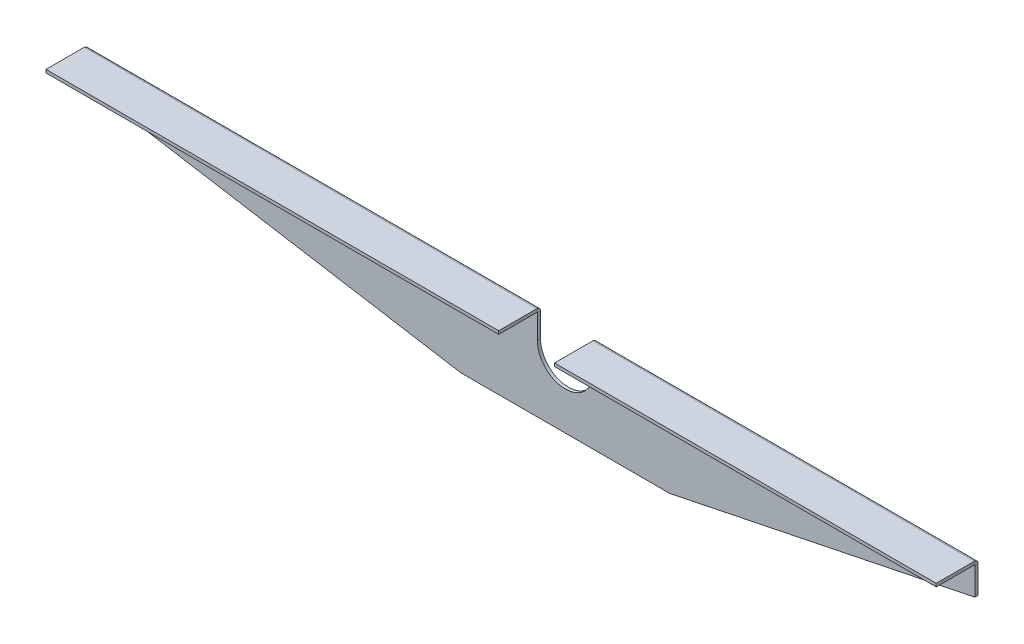
ISO-10303-21;
HEADER;
FILE_DESCRIPTION(('STEP AP214'),'2;1');
FILE_NAME('part.step','',(''),(''),'','','');
FILE_SCHEMA(('AUTOMOTIVE_DESIGN { 1 0 10303 214 1 1 1 1 }'));
ENDSEC;
DATA;
#1=APPLICATION_CONTEXT('core data for automotive mechanical design processes');
#2=APPLICATION_PROTOCOL_DEFINITION('international standard','automotive_design',2000,#1);
#3=PRODUCT_CONTEXT('',#1,'mechanical');
#4=PRODUCT('Part','Part','',(#3));
#5=PRODUCT_RELATED_PRODUCT_CATEGORY('part','',(#4));
#6=PRODUCT_DEFINITION_FORMATION('','',#4);
#7=PRODUCT_DEFINITION_CONTEXT('part definition',#1,'design');
#8=PRODUCT_DEFINITION('design','',#6,#7);
#9=PRODUCT_DEFINITION_SHAPE('','',#8);
#10=(LENGTH_UNIT() NAMED_UNIT(*) SI_UNIT(.MILLI.,.METRE.));
#11=(NAMED_UNIT(*) PLANE_ANGLE_UNIT() SI_UNIT($,.RADIAN.));
#12=(NAMED_UNIT(*) SI_UNIT($,.STERADIAN.) SOLID_ANGLE_UNIT());
#13=UNCERTAINTY_MEASURE_WITH_UNIT(LENGTH_MEASURE(1.E-05),#10,'distance_accuracy_value','');
#14=(GEOMETRIC_REPRESENTATION_CONTEXT(3) GLOBAL_UNCERTAINTY_ASSIGNED_CONTEXT((#13)) GLOBAL_UNIT_ASSIGNED_CONTEXT((#10,
#11,#12)) REPRESENTATION_CONTEXT('',''));
#15=CARTESIAN_POINT('',(0.,0.,0.));
#16=DIRECTION('',(0.,0.,1.));
#17=DIRECTION('',(1.,0.,0.));
#18=AXIS2_PLACEMENT_3D('',#15,#16,#17);
#19=CARTESIAN_POINT('',(0.,0.,-1.49999999999995));
#20=DIRECTION('',(0.,0.,1.));
#21=DIRECTION('',(1.,0.,0.));
#22=AXIS2_PLACEMENT_3D('',#19,#20,#21);
#23=PLANE('',#22);
#24=DIRECTION('',(-1.,0.,0.));
#25=VECTOR('',#24,1.);
#26=CARTESIAN_POINT('',(13.35,11.65,-1.49999999999995));
#27=LINE('',#26,#25);
#28=CARTESIAN_POINT('',(13.35,11.65,-1.49999999999995));
#29=VERTEX_POINT('',#28);
#30=CARTESIAN_POINT('',(196.,11.65,-1.49999999999939));
#31=VERTEX_POINT('',#30);
#32=EDGE_CURVE('E266',#29,#31,#27,.F.);
#33=ORIENTED_EDGE('',*,*,#32,.T.);
#34=DIRECTION('',(0.,1.,0.));
#35=VECTOR('',#34,1.);
#36=CARTESIAN_POINT('',(196.,13.35,-1.49999999999939));
#37=LINE('',#36,#35);
#38=CARTESIAN_POINT('',(196.,-1.65000000000004,-1.49999999999939));
#39=VERTEX_POINT('',#38);
#40=EDGE_CURVE('E392',#39,#31,#37,.T.);
#41=ORIENTED_EDGE('',*,*,#40,.F.);
#42=DIRECTION('',(0.979534918634303,0.201274298349514,0.));
#43=VECTOR('',#42,1.);
#44=CARTESIAN_POINT('',(196.,-1.65000000000004,-1.49999999999939));
#45=LINE('',#44,#43);
#46=CARTESIAN_POINT('',(50.,-31.65,-1.49999999999939));
#47=VERTEX_POINT('',#46);
#48=EDGE_CURVE('E388',#47,#39,#45,.T.);
#49=ORIENTED_EDGE('',*,*,#48,.F.);
#50=DIRECTION('',(1.,0.,0.));
#51=VECTOR('',#50,1.);
#52=CARTESIAN_POINT('',(50.,-31.65,-1.49999999999939));
#53=LINE('',#52,#51);
#54=CARTESIAN_POINT('',(-50.,-31.65,-1.49999999999995));
#55=VERTEX_POINT('',#54);
#56=EDGE_CURVE('E384',#55,#47,#53,.T.);
#57=ORIENTED_EDGE('',*,*,#56,.F.);
#58=DIRECTION('',(0.986393923832144,-0.164398987305357,0.));
#59=VECTOR('',#58,1.);
#60=CARTESIAN_POINT('',(-50.,-31.65,-1.49999999999995));
#61=LINE('',#60,#59);
#62=CARTESIAN_POINT('',(-230.,-1.65000000000004,-1.49999999999995));
#63=VERTEX_POINT('',#62);
#64=EDGE_CURVE('E380',#63,#55,#61,.T.);
#65=ORIENTED_EDGE('',*,*,#64,.F.);
#66=DIRECTION('',(0.,-1.,0.));
#67=VECTOR('',#66,1.);
#68=CARTESIAN_POINT('',(-230.,-1.65000000000004,-1.49999999999995));
#69=LINE('',#68,#67);
#70=CARTESIAN_POINT('',(-230.,11.65,-1.49999999999995));
#71=VERTEX_POINT('',#70);
#72=EDGE_CURVE('E377',#71,#63,#69,.T.);
#73=ORIENTED_EDGE('',*,*,#72,.F.);
#74=DIRECTION('',(-1.,0.,0.));
#75=VECTOR('',#74,1.);
#76=CARTESIAN_POINT('',(-230.,11.65,-1.49999999999995));
#77=LINE('',#76,#75);
#78=CARTESIAN_POINT('',(-13.35,11.65,-1.49999999999939));
#79=VERTEX_POINT('',#78);
#80=EDGE_CURVE('E337',#71,#79,#77,.F.);
#81=ORIENTED_EDGE('',*,*,#80,.T.);
#82=DIRECTION('',(0.,1.,0.));
#83=VECTOR('',#82,1.);
#84=CARTESIAN_POINT('',(-13.35,13.35,-1.49999999999939));
#85=LINE('',#84,#83);
#86=CARTESIAN_POINT('',(-13.35,0.,-1.49999999999939));
#87=VERTEX_POINT('',#86);
#88=EDGE_CURVE('E372',#87,#79,#85,.T.);
#89=ORIENTED_EDGE('',*,*,#88,.F.);
#90=CARTESIAN_POINT('',(0.,0.,-1.49999999999995));
#91=DIRECTION('',(0.,0.,-1.));
#92=DIRECTION('',(1.,0.,0.));
#93=AXIS2_PLACEMENT_3D('',#90,#91,#92);
#94=CIRCLE('',#93,13.35);
#95=CARTESIAN_POINT('',(13.35,0.,-1.49999999999995));
#96=VERTEX_POINT('',#95);
#97=EDGE_CURVE('E368',#96,#87,#94,.T.);
#98=ORIENTED_EDGE('',*,*,#97,.F.);
#99=DIRECTION('',(0.,-1.,0.));
#100=VECTOR('',#99,1.);
#101=CARTESIAN_POINT('',(13.35,0.,-1.49999999999995));
#102=LINE('',#101,#100);
#103=EDGE_CURVE('E395',#29,#96,#102,.T.);
#104=ORIENTED_EDGE('',*,*,#103,.F.);
#105=EDGE_LOOP('',(#33,#41,#49,#57,#65,#73,#81,#89,#98,#104));
#106=FACE_BOUND('',#105,.T.);
#107=ADVANCED_FACE('F83',(#106),#23,.F.);
#108=CARTESIAN_POINT('',(0.,0.,0.));
#109=DIRECTION('',(0.,0.,1.));
#110=DIRECTION('',(1.,0.,0.));
#111=AXIS2_PLACEMENT_3D('',#108,#109,#110);
#112=PLANE('',#111);
#113=DIRECTION('',(0.,1.,0.));
#114=VECTOR('',#113,1.);
#115=CARTESIAN_POINT('',(196.,13.35,6.66133814775094E-13));
#116=LINE('',#115,#114);
#117=CARTESIAN_POINT('',(196.,-1.65000000000004,6.66133814775094E-13));
#118=VERTEX_POINT('',#117);
#119=CARTESIAN_POINT('',(196.,11.65,6.66133814775094E-13));
#120=VERTEX_POINT('',#119);
#121=EDGE_CURVE('E420',#118,#120,#116,.T.);
#122=ORIENTED_EDGE('',*,*,#121,.T.);
#123=DIRECTION('',(-1.,0.,0.));
#124=VECTOR('',#123,1.);
#125=CARTESIAN_POINT('',(13.35,11.65,0.));
#126=LINE('',#125,#124);
#127=CARTESIAN_POINT('',(13.35,11.65,0.));
#128=VERTEX_POINT('',#127);
#129=EDGE_CURVE('E101',#128,#120,#126,.F.);
#130=ORIENTED_EDGE('',*,*,#129,.F.);
#131=DIRECTION('',(0.,-1.,0.));
#132=VECTOR('',#131,1.);
#133=CARTESIAN_POINT('',(13.35,0.,0.));
#134=LINE('',#133,#132);
#135=CARTESIAN_POINT('',(13.35,0.,0.));
#136=VERTEX_POINT('',#135);
#137=EDGE_CURVE('E373',#128,#136,#134,.T.);
#138=ORIENTED_EDGE('',*,*,#137,.T.);
#139=CARTESIAN_POINT('',(0.,0.,0.));
#140=DIRECTION('',(0.,0.,-1.));
#141=DIRECTION('',(1.,0.,0.));
#142=AXIS2_PLACEMENT_3D('',#139,#140,#141);
#143=CIRCLE('',#142,13.35);
#144=CARTESIAN_POINT('',(-13.35,0.,6.66133814775094E-13));
#145=VERTEX_POINT('',#144);
#146=EDGE_CURVE('E364',#136,#145,#143,.T.);
#147=ORIENTED_EDGE('',*,*,#146,.T.);
#148=DIRECTION('',(0.,1.,0.));
#149=VECTOR('',#148,1.);
#150=CARTESIAN_POINT('',(-13.35,13.35,6.66133814775094E-13));
#151=LINE('',#150,#149);
#152=CARTESIAN_POINT('',(-13.35,11.65,6.66133814775094E-13));
#153=VERTEX_POINT('',#152);
#154=EDGE_CURVE('E401',#145,#153,#151,.T.);
#155=ORIENTED_EDGE('',*,*,#154,.T.);
#156=DIRECTION('',(-1.,0.,0.));
#157=VECTOR('',#156,1.);
#158=CARTESIAN_POINT('',(-230.,11.65,0.));
#159=LINE('',#158,#157);
#160=CARTESIAN_POINT('',(-230.,11.65,0.));
#161=VERTEX_POINT('',#160);
#162=EDGE_CURVE('E353',#161,#153,#159,.F.);
#163=ORIENTED_EDGE('',*,*,#162,.F.);
#164=DIRECTION('',(0.,-1.,0.));
#165=VECTOR('',#164,1.);
#166=CARTESIAN_POINT('',(-230.,-1.65000000000004,0.));
#167=LINE('',#166,#165);
#168=CARTESIAN_POINT('',(-230.,-1.65000000000004,0.));
#169=VERTEX_POINT('',#168);
#170=EDGE_CURVE('E405',#161,#169,#167,.T.);
#171=ORIENTED_EDGE('',*,*,#170,.T.);
#172=DIRECTION('',(0.986393923832144,-0.164398987305357,0.));
#173=VECTOR('',#172,1.);
#174=CARTESIAN_POINT('',(-50.,-31.65,0.));
#175=LINE('',#174,#173);
#176=CARTESIAN_POINT('',(-50.,-31.65,0.));
#177=VERTEX_POINT('',#176);
#178=EDGE_CURVE('E408',#169,#177,#175,.T.);
#179=ORIENTED_EDGE('',*,*,#178,.T.);
#180=DIRECTION('',(1.,0.,0.));
#181=VECTOR('',#180,1.);
#182=CARTESIAN_POINT('',(50.,-31.65,6.66133814775094E-13));
#183=LINE('',#182,#181);
#184=CARTESIAN_POINT('',(50.,-31.65,6.66133814775094E-13));
#185=VERTEX_POINT('',#184);
#186=EDGE_CURVE('E412',#177,#185,#183,.T.);
#187=ORIENTED_EDGE('',*,*,#186,.T.);
#188=DIRECTION('',(0.979534918634303,0.201274298349514,0.));
#189=VECTOR('',#188,1.);
#190=CARTESIAN_POINT('',(196.,-1.65000000000004,6.66133814775094E-13));
#191=LINE('',#190,#189);
#192=EDGE_CURVE('E416',#185,#118,#191,.T.);
#193=ORIENTED_EDGE('',*,*,#192,.T.);
#194=EDGE_LOOP('',(#122,#130,#138,#147,#155,#163,#171,#179,#187,#193));
#195=FACE_BOUND('',#194,.T.);
#196=ADVANCED_FACE('F450',(#195),#112,.T.);
#197=CARTESIAN_POINT('',(13.35,0.,-1.49999999999995));
#198=DIRECTION('',(-1.,0.,0.));
#199=DIRECTION('',(0.,0.,1.));
#200=AXIS2_PLACEMENT_3D('',#197,#198,#199);
#201=PLANE('',#200);
#202=ORIENTED_EDGE('',*,*,#137,.F.);
#203=DIRECTION('',(0.,0.,-1.));
#204=VECTOR('',#203,1.);
#205=CARTESIAN_POINT('',(13.35,11.65,0.));
#206=LINE('',#205,#204);
#207=EDGE_CURVE('E275',#128,#29,#206,.T.);
#208=ORIENTED_EDGE('',*,*,#207,.T.);
#209=ORIENTED_EDGE('',*,*,#103,.T.);
#210=DIRECTION('',(0.,0.,1.));
#211=VECTOR('',#210,1.);
#212=CARTESIAN_POINT('',(13.35,0.,-1.49999999999995));
#213=LINE('',#212,#211);
#214=EDGE_CURVE('E13',#96,#136,#213,.T.);
#215=ORIENTED_EDGE('',*,*,#214,.T.);
#216=EDGE_LOOP('',(#202,#208,#209,#215));
#217=FACE_BOUND('',#216,.T.);
#218=ADVANCED_FACE('F453',(#217),#201,.T.);
#219=CARTESIAN_POINT('',(-230.,-1.65000000000004,-1.49999999999995));
#220=DIRECTION('',(-1.,0.,0.));
#221=DIRECTION('',(0.,0.,1.));
#222=AXIS2_PLACEMENT_3D('',#219,#220,#221);
#223=PLANE('',#222);
#224=ORIENTED_EDGE('',*,*,#170,.F.);
#225=DIRECTION('',(0.,0.,-1.));
#226=VECTOR('',#225,1.);
#227=CARTESIAN_POINT('',(-230.,11.65,0.));
#228=LINE('',#227,#226);
#229=EDGE_CURVE('E345',#161,#71,#228,.T.);
#230=ORIENTED_EDGE('',*,*,#229,.T.);
#231=ORIENTED_EDGE('',*,*,#72,.T.);
#232=DIRECTION('',(0.,0.,1.));
#233=VECTOR('',#232,1.);
#234=CARTESIAN_POINT('',(-230.,-1.65000000000004,-1.49999999999995));
#235=LINE('',#234,#233);
#236=EDGE_CURVE('E432',#63,#169,#235,.T.);
#237=ORIENTED_EDGE('',*,*,#236,.T.);
#238=EDGE_LOOP('',(#224,#230,#231,#237));
#239=FACE_BOUND('',#238,.T.);
#240=ADVANCED_FACE('F508',(#239),#223,.T.);
#241=CARTESIAN_POINT('',(0.,0.,-1.49999999999995));
#242=DIRECTION('',(0.,0.,1.));
#243=DIRECTION('',(1.,0.,0.));
#244=AXIS2_PLACEMENT_3D('',#241,#242,#243);
#245=CYLINDRICAL_SURFACE('',#244,13.35);
#246=ORIENTED_EDGE('',*,*,#146,.F.);
#247=ORIENTED_EDGE('',*,*,#214,.F.);
#248=ORIENTED_EDGE('',*,*,#97,.T.);
#249=DIRECTION('',(0.,0.,1.));
#250=VECTOR('',#249,1.);
#251=CARTESIAN_POINT('',(-13.35,0.,-1.49999999999939));
#252=LINE('',#251,#250);
#253=EDGE_CURVE('E87',#87,#145,#252,.T.);
#254=ORIENTED_EDGE('',*,*,#253,.T.);
#255=EDGE_LOOP('',(#246,#247,#248,#254));
#256=FACE_BOUND('',#255,.T.);
#257=ADVANCED_FACE('F85',(#256),#245,.F.);
#258=CARTESIAN_POINT('',(196.,13.35,-1.49999999999939));
#259=DIRECTION('',(1.,0.,0.));
#260=DIRECTION('',(0.,0.,-1.));
#261=AXIS2_PLACEMENT_3D('',#258,#259,#260);
#262=PLANE('',#261);
#263=DIRECTION('',(0.,0.,-1.));
#264=VECTOR('',#263,1.);
#265=CARTESIAN_POINT('',(196.,11.65,6.66133814775094E-13));
#266=LINE('',#265,#264);
#267=EDGE_CURVE('E109',#120,#31,#266,.T.);
#268=ORIENTED_EDGE('',*,*,#267,.F.);
#269=ORIENTED_EDGE('',*,*,#121,.F.);
#270=DIRECTION('',(0.,0.,1.));
#271=VECTOR('',#270,1.);
#272=CARTESIAN_POINT('',(196.,-1.65000000000004,-1.49999999999939));
#273=LINE('',#272,#271);
#274=EDGE_CURVE('E93',#39,#118,#273,.T.);
#275=ORIENTED_EDGE('',*,*,#274,.F.);
#276=ORIENTED_EDGE('',*,*,#40,.T.);
#277=EDGE_LOOP('',(#268,#269,#275,#276));
#278=FACE_BOUND('',#277,.T.);
#279=ADVANCED_FACE('F509',(#278),#262,.T.);
#280=CARTESIAN_POINT('',(196.,-1.65000000000004,-1.49999999999939));
#281=DIRECTION('',(0.201274298349514,-0.979534918634303,0.));
#282=DIRECTION('',(0.979534918634303,0.201274298349514,0.));
#283=AXIS2_PLACEMENT_3D('',#280,#281,#282);
#284=PLANE('',#283);
#285=ORIENTED_EDGE('',*,*,#192,.F.);
#286=DIRECTION('',(0.,0.,1.));
#287=VECTOR('',#286,1.);
#288=CARTESIAN_POINT('',(50.,-31.65,-1.49999999999939));
#289=LINE('',#288,#287);
#290=EDGE_CURVE('E427',#47,#185,#289,.T.);
#291=ORIENTED_EDGE('',*,*,#290,.F.);
#292=ORIENTED_EDGE('',*,*,#48,.T.);
#293=ORIENTED_EDGE('',*,*,#274,.T.);
#294=EDGE_LOOP('',(#285,#291,#292,#293));
#295=FACE_BOUND('',#294,.T.);
#296=ADVANCED_FACE('F512',(#295),#284,.T.);
#297=CARTESIAN_POINT('',(50.,-31.65,-1.49999999999939));
#298=DIRECTION('',(0.,-1.,0.));
#299=DIRECTION('',(1.,0.,0.));
#300=AXIS2_PLACEMENT_3D('',#297,#298,#299);
#301=PLANE('',#300);
#302=ORIENTED_EDGE('',*,*,#186,.F.);
#303=DIRECTION('',(0.,0.,1.));
#304=VECTOR('',#303,1.);
#305=CARTESIAN_POINT('',(-50.,-31.65,-1.49999999999995));
#306=LINE('',#305,#304);
#307=EDGE_CURVE('E430',#55,#177,#306,.T.);
#308=ORIENTED_EDGE('',*,*,#307,.F.);
#309=ORIENTED_EDGE('',*,*,#56,.T.);
#310=ORIENTED_EDGE('',*,*,#290,.T.);
#311=EDGE_LOOP('',(#302,#308,#309,#310));
#312=FACE_BOUND('',#311,.T.);
#313=ADVANCED_FACE('F515',(#312),#301,.T.);
#314=CARTESIAN_POINT('',(-50.,-31.65,-1.49999999999995));
#315=DIRECTION('',(-0.164398987305357,-0.986393923832144,0.));
#316=DIRECTION('',(0.986393923832144,-0.164398987305357,0.));
#317=AXIS2_PLACEMENT_3D('',#314,#315,#316);
#318=PLANE('',#317);
#319=ORIENTED_EDGE('',*,*,#178,.F.);
#320=ORIENTED_EDGE('',*,*,#236,.F.);
#321=ORIENTED_EDGE('',*,*,#64,.T.);
#322=ORIENTED_EDGE('',*,*,#307,.T.);
#323=EDGE_LOOP('',(#319,#320,#321,#322));
#324=FACE_BOUND('',#323,.T.);
#325=ADVANCED_FACE('F519',(#324),#318,.T.);
#326=CARTESIAN_POINT('',(-13.35,13.35,-1.49999999999939));
#327=DIRECTION('',(1.,0.,0.));
#328=DIRECTION('',(0.,0.,-1.));
#329=AXIS2_PLACEMENT_3D('',#326,#327,#328);
#330=PLANE('',#329);
#331=DIRECTION('',(0.,0.,-1.));
#332=VECTOR('',#331,1.);
#333=CARTESIAN_POINT('',(-13.35,11.65,6.66133814775094E-13));
#334=LINE('',#333,#332);
#335=EDGE_CURVE('E360',#153,#79,#334,.T.);
#336=ORIENTED_EDGE('',*,*,#335,.F.);
#337=ORIENTED_EDGE('',*,*,#154,.F.);
#338=ORIENTED_EDGE('',*,*,#253,.F.);
#339=ORIENTED_EDGE('',*,*,#88,.T.);
#340=EDGE_LOOP('',(#336,#337,#338,#339));
#341=FACE_BOUND('',#340,.T.);
#342=ADVANCED_FACE('F449',(#341),#330,.T.);
#343=CARTESIAN_POINT('',(-13.35,11.65,0.200000000000644));
#344=DIRECTION('',(1.,0.,0.));
#345=DIRECTION('',(0.,0.,-1.));
#346=AXIS2_PLACEMENT_3D('',#343,#344,#345);
#347=PLANE('',#346);
#348=DIRECTION('',(0.,-1.,0.));
#349=VECTOR('',#348,1.);
#350=CARTESIAN_POINT('',(-13.35,13.35,0.200000000000644));
#351=LINE('',#350,#349);
#352=CARTESIAN_POINT('',(-13.35,11.85,0.200000000000644));
#353=VERTEX_POINT('',#352);
#354=CARTESIAN_POINT('',(-13.35,13.35,0.200000000000644));
#355=VERTEX_POINT('',#354);
#356=EDGE_CURVE('E291',#353,#355,#351,.F.);
#357=ORIENTED_EDGE('',*,*,#356,.F.);
#358=CARTESIAN_POINT('',(-13.35,11.65,0.200000000000644));
#359=DIRECTION('',(-1.,0.,0.));
#360=DIRECTION('',(0.,0.,1.));
#361=AXIS2_PLACEMENT_3D('',#358,#359,#360);
#362=CIRCLE('',#361,0.200000000000001);
#363=EDGE_CURVE('E349',#153,#353,#362,.F.);
#364=ORIENTED_EDGE('',*,*,#363,.F.);
#365=ORIENTED_EDGE('',*,*,#335,.T.);
#366=CARTESIAN_POINT('',(-13.35,11.65,0.200000000000644));
#367=DIRECTION('',(-1.,0.,0.));
#368=DIRECTION('',(0.,0.,1.));
#369=AXIS2_PLACEMENT_3D('',#366,#367,#368);
#370=CIRCLE('',#369,1.7);
#371=EDGE_CURVE('E340',#79,#355,#370,.F.);
#372=ORIENTED_EDGE('',*,*,#371,.T.);
#373=EDGE_LOOP('',(#357,#364,#365,#372));
#374=FACE_BOUND('',#373,.T.);
#375=ADVANCED_FACE('F459',(#374),#347,.T.);
#376=CARTESIAN_POINT('',(-230.,11.65,0.200000000000089));
#377=DIRECTION('',(1.,0.,0.));
#378=DIRECTION('',(0.,0.,-1.));
#379=AXIS2_PLACEMENT_3D('',#376,#377,#378);
#380=PLANE('',#379);
#381=CARTESIAN_POINT('',(-230.,11.65,0.200000000000089));
#382=DIRECTION('',(-1.,0.,0.));
#383=DIRECTION('',(0.,0.,1.));
#384=AXIS2_PLACEMENT_3D('',#381,#382,#383);
#385=CIRCLE('',#384,0.200000000000001);
#386=CARTESIAN_POINT('',(-230.,11.85,0.200000000000089));
#387=VERTEX_POINT('',#386);
#388=EDGE_CURVE('E299',#387,#161,#385,.T.);
#389=ORIENTED_EDGE('',*,*,#388,.F.);
#390=DIRECTION('',(0.,-1.,0.));
#391=VECTOR('',#390,1.);
#392=CARTESIAN_POINT('',(-230.,11.85,0.200000000000089));
#393=LINE('',#392,#391);
#394=CARTESIAN_POINT('',(-230.,13.35,0.200000000000089));
#395=VERTEX_POINT('',#394);
#396=EDGE_CURVE('E327',#387,#395,#393,.F.);
#397=ORIENTED_EDGE('',*,*,#396,.T.);
#398=CARTESIAN_POINT('',(-230.,11.65,0.200000000000089));
#399=DIRECTION('',(-1.,0.,0.));
#400=DIRECTION('',(0.,0.,1.));
#401=AXIS2_PLACEMENT_3D('',#398,#399,#400);
#402=CIRCLE('',#401,1.7);
#403=EDGE_CURVE('E341',#395,#71,#402,.T.);
#404=ORIENTED_EDGE('',*,*,#403,.T.);
#405=ORIENTED_EDGE('',*,*,#229,.F.);
#406=EDGE_LOOP('',(#389,#397,#404,#405));
#407=FACE_BOUND('',#406,.T.);
#408=ADVANCED_FACE('F503',(#407),#380,.F.);
#409=CARTESIAN_POINT('',(-230.,11.65,0.200000000000089));
#410=DIRECTION('',(-1.,0.,0.));
#411=DIRECTION('',(0.,1.,0.));
#412=AXIS2_PLACEMENT_3D('',#409,#410,#411);
#413=CYLINDRICAL_SURFACE('',#412,1.7);
#414=ORIENTED_EDGE('',*,*,#80,.F.);
#415=ORIENTED_EDGE('',*,*,#403,.F.);
#416=DIRECTION('',(-1.,0.,0.));
#417=VECTOR('',#416,1.);
#418=CARTESIAN_POINT('',(-13.35,13.35,0.200000000000644));
#419=LINE('',#418,#417);
#420=EDGE_CURVE('E324',#395,#355,#419,.F.);
#421=ORIENTED_EDGE('',*,*,#420,.T.);
#422=ORIENTED_EDGE('',*,*,#371,.F.);
#423=EDGE_LOOP('',(#414,#415,#421,#422));
#424=FACE_BOUND('',#423,.T.);
#425=ADVANCED_FACE('F461',(#424),#413,.T.);
#426=CARTESIAN_POINT('',(-230.,11.65,0.200000000000089));
#427=DIRECTION('',(-1.,0.,0.));
#428=DIRECTION('',(0.,1.,0.));
#429=AXIS2_PLACEMENT_3D('',#426,#427,#428);
#430=CYLINDRICAL_SURFACE('',#429,0.200000000000001);
#431=ORIENTED_EDGE('',*,*,#162,.T.);
#432=ORIENTED_EDGE('',*,*,#363,.T.);
#433=DIRECTION('',(-1.,0.,0.));
#434=VECTOR('',#433,1.);
#435=CARTESIAN_POINT('',(-13.35,11.85,0.200000000000644));
#436=LINE('',#435,#434);
#437=EDGE_CURVE('E331',#353,#387,#436,.T.);
#438=ORIENTED_EDGE('',*,*,#437,.T.);
#439=ORIENTED_EDGE('',*,*,#388,.T.);
#440=EDGE_LOOP('',(#431,#432,#438,#439));
#441=FACE_BOUND('',#440,.T.);
#442=ADVANCED_FACE('F482',(#441),#430,.F.);
#443=CARTESIAN_POINT('',(-230.,13.3500000000001,18.5000000000001));
#444=DIRECTION('',(1.,0.,0.));
#445=DIRECTION('',(0.,1.,0.));
#446=AXIS2_PLACEMENT_3D('',#443,#444,#445);
#447=PLANE('',#446);
#448=ORIENTED_EDGE('',*,*,#396,.F.);
#449=DIRECTION('',(0.,0.,-1.));
#450=VECTOR('',#449,1.);
#451=CARTESIAN_POINT('',(-230.,11.85,18.5000000000001));
#452=LINE('',#451,#450);
#453=CARTESIAN_POINT('',(-230.,11.85,18.5000000000001));
#454=VERTEX_POINT('',#453);
#455=EDGE_CURVE('E321',#387,#454,#452,.F.);
#456=ORIENTED_EDGE('',*,*,#455,.T.);
#457=DIRECTION('',(0.,-1.,0.));
#458=VECTOR('',#457,1.);
#459=CARTESIAN_POINT('',(-230.,13.3500000000001,18.5000000000001));
#460=LINE('',#459,#458);
#461=CARTESIAN_POINT('',(-230.,13.3500000000001,18.5000000000001));
#462=VERTEX_POINT('',#461);
#463=EDGE_CURVE('E295',#462,#454,#460,.T.);
#464=ORIENTED_EDGE('',*,*,#463,.F.);
#465=DIRECTION('',(0.,0.,1.));
#466=VECTOR('',#465,1.);
#467=CARTESIAN_POINT('',(-230.,13.35,0.));
#468=LINE('',#467,#466);
#469=EDGE_CURVE('E311',#395,#462,#468,.T.);
#470=ORIENTED_EDGE('',*,*,#469,.F.);
#471=EDGE_LOOP('',(#448,#456,#464,#470));
#472=FACE_BOUND('',#471,.T.);
#473=ADVANCED_FACE('F470',(#472),#447,.F.);
#474=CARTESIAN_POINT('',(-13.35,13.35,6.66133814775094E-13));
#475=DIRECTION('',(-1.,0.,0.));
#476=DIRECTION('',(0.,0.,1.));
#477=AXIS2_PLACEMENT_3D('',#474,#475,#476);
#478=PLANE('',#477);
#479=ORIENTED_EDGE('',*,*,#356,.T.);
#480=DIRECTION('',(0.,0.,-1.));
#481=VECTOR('',#480,1.);
#482=CARTESIAN_POINT('',(-13.35,13.35,5.55111512312578E-13));
#483=LINE('',#482,#481);
#484=CARTESIAN_POINT('',(-13.35,13.3500000000001,18.5000000000006));
#485=VERTEX_POINT('',#484);
#486=EDGE_CURVE('E304',#485,#355,#483,.T.);
#487=ORIENTED_EDGE('',*,*,#486,.F.);
#488=DIRECTION('',(0.,-1.,0.));
#489=VECTOR('',#488,1.);
#490=CARTESIAN_POINT('',(-13.35,13.3500000000001,18.5000000000006));
#491=LINE('',#490,#489);
#492=CARTESIAN_POINT('',(-13.35,11.85,18.5000000000006));
#493=VERTEX_POINT('',#492);
#494=EDGE_CURVE('E300',#485,#493,#491,.T.);
#495=ORIENTED_EDGE('',*,*,#494,.T.);
#496=DIRECTION('',(0.,0.,1.));
#497=VECTOR('',#496,1.);
#498=CARTESIAN_POINT('',(-13.35,11.85,6.66133814775094E-13));
#499=LINE('',#498,#497);
#500=EDGE_CURVE('E314',#493,#353,#499,.F.);
#501=ORIENTED_EDGE('',*,*,#500,.T.);
#502=EDGE_LOOP('',(#479,#487,#495,#501));
#503=FACE_BOUND('',#502,.T.);
#504=ADVANCED_FACE('F479',(#503),#478,.F.);
#505=CARTESIAN_POINT('',(0.,13.35,-1.11022302462516E-13));
#506=DIRECTION('',(0.,-1.,0.));
#507=DIRECTION('',(0.,0.,-1.));
#508=AXIS2_PLACEMENT_3D('',#505,#506,#507);
#509=PLANE('',#508);
#510=ORIENTED_EDGE('',*,*,#420,.F.);
#511=ORIENTED_EDGE('',*,*,#469,.T.);
#512=DIRECTION('',(1.,0.,0.));
#513=VECTOR('',#512,1.);
#514=CARTESIAN_POINT('',(1.66533453693773E-13,13.3500000000001,18.5));
#515=LINE('',#514,#513);
#516=EDGE_CURVE('E308',#462,#485,#515,.T.);
#517=ORIENTED_EDGE('',*,*,#516,.T.);
#518=ORIENTED_EDGE('',*,*,#486,.T.);
#519=EDGE_LOOP('',(#510,#511,#517,#518));
#520=FACE_BOUND('',#519,.T.);
#521=ADVANCED_FACE('F465',(#520),#509,.F.);
#522=CARTESIAN_POINT('',(0.,11.85,0.));
#523=DIRECTION('',(0.,-1.,0.));
#524=DIRECTION('',(0.,0.,-1.));
#525=AXIS2_PLACEMENT_3D('',#522,#523,#524);
#526=PLANE('',#525);
#527=ORIENTED_EDGE('',*,*,#455,.F.);
#528=ORIENTED_EDGE('',*,*,#437,.F.);
#529=ORIENTED_EDGE('',*,*,#500,.F.);
#530=DIRECTION('',(-1.,0.,0.));
#531=VECTOR('',#530,1.);
#532=CARTESIAN_POINT('',(-13.35,11.85,18.5000000000006));
#533=LINE('',#532,#531);
#534=EDGE_CURVE('E318',#454,#493,#533,.F.);
#535=ORIENTED_EDGE('',*,*,#534,.F.);
#536=EDGE_LOOP('',(#527,#528,#529,#535));
#537=FACE_BOUND('',#536,.T.);
#538=ADVANCED_FACE('F485',(#537),#526,.T.);
#539=CARTESIAN_POINT('',(-13.35,13.3500000000001,18.5000000000006));
#540=DIRECTION('',(0.,0.,-1.));
#541=DIRECTION('',(0.,1.,0.));
#542=AXIS2_PLACEMENT_3D('',#539,#540,#541);
#543=PLANE('',#542);
#544=ORIENTED_EDGE('',*,*,#534,.T.);
#545=ORIENTED_EDGE('',*,*,#494,.F.);
#546=ORIENTED_EDGE('',*,*,#516,.F.);
#547=ORIENTED_EDGE('',*,*,#463,.T.);
#548=EDGE_LOOP('',(#544,#545,#546,#547));
#549=FACE_BOUND('',#548,.T.);
#550=ADVANCED_FACE('F476',(#549),#543,.F.);
#551=CARTESIAN_POINT('',(196.,11.65,0.200000000000644));
#552=DIRECTION('',(1.,0.,0.));
#553=DIRECTION('',(0.,0.,-1.));
#554=AXIS2_PLACEMENT_3D('',#551,#552,#553);
#555=PLANE('',#554);
#556=DIRECTION('',(0.,-1.,0.));
#557=VECTOR('',#556,1.);
#558=CARTESIAN_POINT('',(196.,13.35,0.200000000000644));
#559=LINE('',#558,#557);
#560=CARTESIAN_POINT('',(196.,11.85,0.200000000000644));
#561=VERTEX_POINT('',#560);
#562=CARTESIAN_POINT('',(196.,13.35,0.200000000000644));
#563=VERTEX_POINT('',#562);
#564=EDGE_CURVE('E238',#561,#563,#559,.F.);
#565=ORIENTED_EDGE('',*,*,#564,.F.);
#566=CARTESIAN_POINT('',(196.,11.65,0.200000000000644));
#567=DIRECTION('',(-1.,0.,0.));
#568=DIRECTION('',(0.,0.,1.));
#569=AXIS2_PLACEMENT_3D('',#566,#567,#568);
#570=CIRCLE('',#569,0.200000000000002);
#571=EDGE_CURVE('E279',#120,#561,#570,.F.);
#572=ORIENTED_EDGE('',*,*,#571,.F.);
#573=ORIENTED_EDGE('',*,*,#267,.T.);
#574=CARTESIAN_POINT('',(196.,11.65,0.200000000000644));
#575=DIRECTION('',(-1.,0.,0.));
#576=DIRECTION('',(0.,0.,1.));
#577=AXIS2_PLACEMENT_3D('',#574,#575,#576);
#578=CIRCLE('',#577,1.7);
#579=EDGE_CURVE('E270',#31,#563,#578,.F.);
#580=ORIENTED_EDGE('',*,*,#579,.T.);
#581=EDGE_LOOP('',(#565,#572,#573,#580));
#582=FACE_BOUND('',#581,.T.);
#583=ADVANCED_FACE('F492',(#582),#555,.T.);
#584=CARTESIAN_POINT('',(13.35,11.65,0.199999999999978));
#585=DIRECTION('',(1.,0.,0.));
#586=DIRECTION('',(0.,0.,-1.));
#587=AXIS2_PLACEMENT_3D('',#584,#585,#586);
#588=PLANE('',#587);
#589=CARTESIAN_POINT('',(13.35,11.65,0.199999999999978));
#590=DIRECTION('',(-1.,0.,0.));
#591=DIRECTION('',(0.,0.,1.));
#592=AXIS2_PLACEMENT_3D('',#589,#590,#591);
#593=CIRCLE('',#592,0.200000000000002);
#594=CARTESIAN_POINT('',(13.35,11.85,0.199999999999978));
#595=VERTEX_POINT('',#594);
#596=EDGE_CURVE('E285',#595,#128,#593,.T.);
#597=ORIENTED_EDGE('',*,*,#596,.F.);
#598=DIRECTION('',(0.,-1.,0.));
#599=VECTOR('',#598,1.);
#600=CARTESIAN_POINT('',(13.35,11.85,0.199999999999978));
#601=LINE('',#600,#599);
#602=CARTESIAN_POINT('',(13.35,13.35,0.199999999999978));
#603=VERTEX_POINT('',#602);
#604=EDGE_CURVE('E257',#595,#603,#601,.F.);
#605=ORIENTED_EDGE('',*,*,#604,.T.);
#606=CARTESIAN_POINT('',(13.35,11.65,0.199999999999978));
#607=DIRECTION('',(-1.,0.,0.));
#608=DIRECTION('',(0.,0.,1.));
#609=AXIS2_PLACEMENT_3D('',#606,#607,#608);
#610=CIRCLE('',#609,1.7);
#611=EDGE_CURVE('E271',#603,#29,#610,.T.);
#612=ORIENTED_EDGE('',*,*,#611,.T.);
#613=ORIENTED_EDGE('',*,*,#207,.F.);
#614=EDGE_LOOP('',(#597,#605,#612,#613));
#615=FACE_BOUND('',#614,.T.);
#616=ADVANCED_FACE('F570',(#615),#588,.F.);
#617=CARTESIAN_POINT('',(13.35,11.65,0.199999999999978));
#618=DIRECTION('',(-1.,0.,0.));
#619=DIRECTION('',(0.,1.,0.));
#620=AXIS2_PLACEMENT_3D('',#617,#618,#619);
#621=CYLINDRICAL_SURFACE('',#620,1.7);
#622=ORIENTED_EDGE('',*,*,#32,.F.);
#623=ORIENTED_EDGE('',*,*,#611,.F.);
#624=DIRECTION('',(-1.,0.,0.));
#625=VECTOR('',#624,1.);
#626=CARTESIAN_POINT('',(196.,13.35,0.200000000000644));
#627=LINE('',#626,#625);
#628=EDGE_CURVE('E254',#603,#563,#627,.F.);
#629=ORIENTED_EDGE('',*,*,#628,.T.);
#630=ORIENTED_EDGE('',*,*,#579,.F.);
#631=EDGE_LOOP('',(#622,#623,#629,#630));
#632=FACE_BOUND('',#631,.T.);
#633=ADVANCED_FACE('F581',(#632),#621,.T.);
#634=CARTESIAN_POINT('',(13.35,11.65,0.199999999999978));
#635=DIRECTION('',(-1.,0.,0.));
#636=DIRECTION('',(0.,1.,0.));
#637=AXIS2_PLACEMENT_3D('',#634,#635,#636);
#638=CYLINDRICAL_SURFACE('',#637,0.200000000000002);
#639=ORIENTED_EDGE('',*,*,#129,.T.);
#640=ORIENTED_EDGE('',*,*,#571,.T.);
#641=DIRECTION('',(-1.,0.,0.));
#642=VECTOR('',#641,1.);
#643=CARTESIAN_POINT('',(196.,11.85,0.200000000000644));
#644=LINE('',#643,#642);
#645=EDGE_CURVE('E261',#561,#595,#644,.T.);
#646=ORIENTED_EDGE('',*,*,#645,.T.);
#647=ORIENTED_EDGE('',*,*,#596,.T.);
#648=EDGE_LOOP('',(#639,#640,#646,#647));
#649=FACE_BOUND('',#648,.T.);
#650=ADVANCED_FACE('F592',(#649),#638,.F.);
#651=CARTESIAN_POINT('',(13.3499999999999,13.3500000000001,18.5000000000001));
#652=DIRECTION('',(1.,0.,0.));
#653=DIRECTION('',(0.,0.,-1.));
#654=AXIS2_PLACEMENT_3D('',#651,#652,#653);
#655=PLANE('',#654);
#656=ORIENTED_EDGE('',*,*,#604,.F.);
#657=DIRECTION('',(0.,0.,-1.));
#658=VECTOR('',#657,1.);
#659=CARTESIAN_POINT('',(13.3499999999999,11.85,18.5000000000001));
#660=LINE('',#659,#658);
#661=CARTESIAN_POINT('',(13.3499999999999,11.85,18.5000000000001));
#662=VERTEX_POINT('',#661);
#663=EDGE_CURVE('E251',#595,#662,#660,.F.);
#664=ORIENTED_EDGE('',*,*,#663,.T.);
#665=DIRECTION('',(0.,-1.,0.));
#666=VECTOR('',#665,1.);
#667=CARTESIAN_POINT('',(13.3499999999999,13.3500000000001,18.5000000000001));
#668=LINE('',#667,#666);
#669=CARTESIAN_POINT('',(13.3499999999999,13.3500000000001,18.5000000000001));
#670=VERTEX_POINT('',#669);
#671=EDGE_CURVE('E234',#670,#662,#668,.T.);
#672=ORIENTED_EDGE('',*,*,#671,.F.);
#673=DIRECTION('',(0.,0.,1.));
#674=VECTOR('',#673,1.);
#675=CARTESIAN_POINT('',(13.35,13.35,0.));
#676=LINE('',#675,#674);
#677=EDGE_CURVE('E219',#603,#670,#676,.T.);
#678=ORIENTED_EDGE('',*,*,#677,.F.);
#679=EDGE_LOOP('',(#656,#664,#672,#678));
#680=FACE_BOUND('',#679,.T.);
#681=ADVANCED_FACE('F603',(#680),#655,.F.);
#682=CARTESIAN_POINT('',(196.,13.35,6.66133814775094E-13));
#683=DIRECTION('',(-1.,0.,0.));
#684=DIRECTION('',(0.,-1.,0.));
#685=AXIS2_PLACEMENT_3D('',#682,#683,#684);
#686=PLANE('',#685);
#687=ORIENTED_EDGE('',*,*,#564,.T.);
#688=DIRECTION('',(0.,0.,-1.));
#689=VECTOR('',#688,1.);
#690=CARTESIAN_POINT('',(196.,13.35,5.55111512312578E-13));
#691=LINE('',#690,#689);
#692=CARTESIAN_POINT('',(196.,13.3500000000001,18.5000000000006));
#693=VERTEX_POINT('',#692);
#694=EDGE_CURVE('E217',#693,#563,#691,.T.);
#695=ORIENTED_EDGE('',*,*,#694,.F.);
#696=DIRECTION('',(0.,-1.,0.));
#697=VECTOR('',#696,1.);
#698=CARTESIAN_POINT('',(196.,13.3500000000001,18.5000000000006));
#699=LINE('',#698,#697);
#700=CARTESIAN_POINT('',(196.,11.85,18.5000000000006));
#701=VERTEX_POINT('',#700);
#702=EDGE_CURVE('E226',#693,#701,#699,.T.);
#703=ORIENTED_EDGE('',*,*,#702,.T.);
#704=DIRECTION('',(0.,0.,1.));
#705=VECTOR('',#704,1.);
#706=CARTESIAN_POINT('',(196.,11.85,6.66133814775094E-13));
#707=LINE('',#706,#705);
#708=EDGE_CURVE('E246',#701,#561,#707,.F.);
#709=ORIENTED_EDGE('',*,*,#708,.T.);
#710=EDGE_LOOP('',(#687,#695,#703,#709));
#711=FACE_BOUND('',#710,.T.);
#712=ADVANCED_FACE('F237',(#711),#686,.F.);
#713=CARTESIAN_POINT('',(0.,13.35,-1.11022302462516E-13));
#714=DIRECTION('',(0.,-1.,0.));
#715=DIRECTION('',(0.,0.,-1.));
#716=AXIS2_PLACEMENT_3D('',#713,#714,#715);
#717=PLANE('',#716);
#718=ORIENTED_EDGE('',*,*,#628,.F.);
#719=ORIENTED_EDGE('',*,*,#677,.T.);
#720=DIRECTION('',(1.,0.,0.));
#721=VECTOR('',#720,1.);
#722=CARTESIAN_POINT('',(1.66533453693773E-13,13.3500000000001,18.5));
#723=LINE('',#722,#721);
#724=EDGE_CURVE('E212',#670,#693,#723,.T.);
#725=ORIENTED_EDGE('',*,*,#724,.T.);
#726=ORIENTED_EDGE('',*,*,#694,.T.);
#727=EDGE_LOOP('',(#718,#719,#725,#726));
#728=FACE_BOUND('',#727,.T.);
#729=ADVANCED_FACE('F215',(#728),#717,.F.);
#730=CARTESIAN_POINT('',(0.,11.85,0.));
#731=DIRECTION('',(0.,-1.,0.));
#732=DIRECTION('',(0.,0.,-1.));
#733=AXIS2_PLACEMENT_3D('',#730,#731,#732);
#734=PLANE('',#733);
#735=ORIENTED_EDGE('',*,*,#663,.F.);
#736=ORIENTED_EDGE('',*,*,#645,.F.);
#737=ORIENTED_EDGE('',*,*,#708,.F.);
#738=DIRECTION('',(-1.,0.,0.));
#739=VECTOR('',#738,1.);
#740=CARTESIAN_POINT('',(196.,11.85,18.5000000000006));
#741=LINE('',#740,#739);
#742=EDGE_CURVE('E229',#662,#701,#741,.F.);
#743=ORIENTED_EDGE('',*,*,#742,.F.);
#744=EDGE_LOOP('',(#735,#736,#737,#743));
#745=FACE_BOUND('',#744,.T.);
#746=ADVANCED_FACE('F633',(#745),#734,.T.);
#747=CARTESIAN_POINT('',(196.,13.3500000000001,18.5000000000006));
#748=DIRECTION('',(0.,0.,-1.));
#749=DIRECTION('',(0.,1.,0.));
#750=AXIS2_PLACEMENT_3D('',#747,#748,#749);
#751=PLANE('',#750);
#752=ORIENTED_EDGE('',*,*,#742,.T.);
#753=ORIENTED_EDGE('',*,*,#702,.F.);
#754=ORIENTED_EDGE('',*,*,#724,.F.);
#755=ORIENTED_EDGE('',*,*,#671,.T.);
#756=EDGE_LOOP('',(#752,#753,#754,#755));
#757=FACE_BOUND('',#756,.T.);
#758=ADVANCED_FACE('F227',(#757),#751,.F.);
#759=CLOSED_SHELL('',(#107,#196,#218,#240,#257,#279,#296,#313,#325,#342,#375,#408,#425,#442,
#473,#504,#521,#538,#550,#583,#616,#633,#650,#681,#712,#729,#746,#758));
#760=MANIFOLD_SOLID_BREP('B2',#759);
#761=ADVANCED_BREP_SHAPE_REPRESENTATION('',(#18,#760),#14);
#762=SHAPE_DEFINITION_REPRESENTATION(#9,#761);
ENDSEC;
END-ISO-10303-21;
